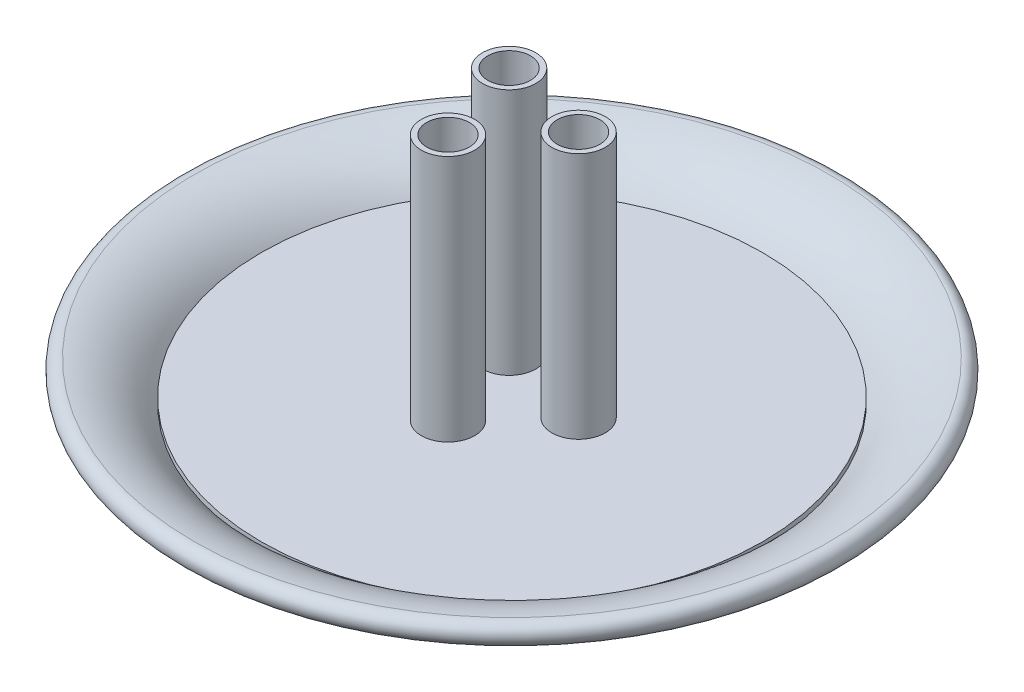
ISO-10303-21;
HEADER;
FILE_DESCRIPTION(('STEP AP214'),'2;1');
FILE_NAME('part.step','',(''),(''),'','','');
FILE_SCHEMA(('AUTOMOTIVE_DESIGN { 1 0 10303 214 1 1 1 1 }'));
ENDSEC;
DATA;
#1=APPLICATION_CONTEXT('core data for automotive mechanical design processes');
#2=APPLICATION_PROTOCOL_DEFINITION('international standard','automotive_design',2000,#1);
#3=PRODUCT_CONTEXT('',#1,'mechanical');
#4=PRODUCT('Part','Part','',(#3));
#5=PRODUCT_RELATED_PRODUCT_CATEGORY('part','',(#4));
#6=PRODUCT_DEFINITION_FORMATION('','',#4);
#7=PRODUCT_DEFINITION_CONTEXT('part definition',#1,'design');
#8=PRODUCT_DEFINITION('design','',#6,#7);
#9=PRODUCT_DEFINITION_SHAPE('','',#8);
#10=(LENGTH_UNIT() NAMED_UNIT(*) SI_UNIT(.MILLI.,.METRE.));
#11=(NAMED_UNIT(*) PLANE_ANGLE_UNIT() SI_UNIT($,.RADIAN.));
#12=(NAMED_UNIT(*) SI_UNIT($,.STERADIAN.) SOLID_ANGLE_UNIT());
#13=UNCERTAINTY_MEASURE_WITH_UNIT(LENGTH_MEASURE(1.E-05),#10,'distance_accuracy_value','');
#14=(GEOMETRIC_REPRESENTATION_CONTEXT(3) GLOBAL_UNCERTAINTY_ASSIGNED_CONTEXT((#13)) GLOBAL_UNIT_ASSIGNED_CONTEXT((#10,
#11,#12)) REPRESENTATION_CONTEXT('',''));
#15=CARTESIAN_POINT('',(0.,0.,0.));
#16=DIRECTION('',(0.,0.,1.));
#17=DIRECTION('',(1.,0.,0.));
#18=AXIS2_PLACEMENT_3D('',#15,#16,#17);
#19=CARTESIAN_POINT('',(13.1192660550459,6.17806077003984,0.));
#20=DIRECTION('',(0.,1.,0.));
#21=DIRECTION('',(0.,0.,1.));
#22=AXIS2_PLACEMENT_3D('',#19,#20,#21);
#23=TOROIDAL_SURFACE('',#22,29.8959735549191,1.);
#24=CARTESIAN_POINT('',(13.1192660550459,5.18348623853211,0.));
#25=DIRECTION('',(0.,1.,0.));
#26=DIRECTION('',(0.,0.,1.));
#27=AXIS2_PLACEMENT_3D('',#24,#25,#26);
#28=CIRCLE('',#27,30.);
#29=CARTESIAN_POINT('',(13.1192660550459,5.18348623853211,30.));
#30=VERTEX_POINT('',#29);
#31=EDGE_CURVE('E134',#30,#30,#28,.T.);
#32=ORIENTED_EDGE('',*,*,#31,.T.);
#33=EDGE_LOOP('',(#32));
#34=FACE_BOUND('',#33,.T.);
#35=CARTESIAN_POINT('',(13.1192660550459,7.17263530154758,0.));
#36=DIRECTION('',(0.,1.,0.));
#37=DIRECTION('',(0.,0.,1.));
#38=AXIS2_PLACEMENT_3D('',#35,#36,#37);
#39=CIRCLE('',#38,29.7919471098382);
#40=CARTESIAN_POINT('',(13.1192660550459,7.17263530154758,29.7919471098382));
#41=VERTEX_POINT('',#40);
#42=EDGE_CURVE('E151',#41,#41,#39,.T.);
#43=ORIENTED_EDGE('',*,*,#42,.F.);
#44=EDGE_LOOP('',(#43));
#45=FACE_BOUND('',#44,.T.);
#46=ADVANCED_FACE('F74',(#34,#45),#23,.T.);
#47=CARTESIAN_POINT('',(13.1192660550459,-1.67957037368538,0.));
#48=DIRECTION('',(0.,1.,0.));
#49=DIRECTION('',(0.,0.,1.));
#50=AXIS2_PLACEMENT_3D('',#47,#48,#49);
#51=TOROIDAL_SURFACE('',#50,30.7178339673305,8.90049503058699);
#52=ORIENTED_EDGE('',*,*,#42,.T.);
#53=EDGE_LOOP('',(#52));
#54=FACE_BOUND('',#53,.T.);
#55=CARTESIAN_POINT('',(13.1192660550459,3.51639603535897,0.));
#56=DIRECTION('',(0.,1.,0.));
#57=DIRECTION('',(0.,0.,1.));
#58=AXIS2_PLACEMENT_3D('',#55,#56,#57);
#59=CIRCLE('',#58,23.4914417232306);
#60=CARTESIAN_POINT('',(13.1192660550459,3.51639603535897,23.4914417232306));
#61=VERTEX_POINT('',#60);
#62=EDGE_CURVE('E148',#61,#61,#59,.T.);
#63=ORIENTED_EDGE('',*,*,#62,.F.);
#64=EDGE_LOOP('',(#63));
#65=FACE_BOUND('',#64,.T.);
#66=ADVANCED_FACE('F292',(#54,#65),#51,.T.);
#67=CARTESIAN_POINT('',(3.11926605504587,-4.81651376146789,0.));
#68=DIRECTION('',(0.,-1.,0.));
#69=DIRECTION('',(0.,0.,-1.));
#70=AXIS2_PLACEMENT_3D('',#67,#68,#69);
#71=PLANE('',#70);
#72=CARTESIAN_POINT('',(13.1192660550459,-4.81651376146789,0.));
#73=DIRECTION('',(0.,1.,0.));
#74=DIRECTION('',(0.,0.,1.));
#75=AXIS2_PLACEMENT_3D('',#72,#73,#74);
#76=CIRCLE('',#75,9.99999999999998);
#77=CARTESIAN_POINT('',(13.1192660550459,-4.81651376146789,9.99999999999998));
#78=VERTEX_POINT('',#77);
#79=EDGE_CURVE('E142',#78,#78,#76,.T.);
#80=ORIENTED_EDGE('',*,*,#79,.F.);
#81=EDGE_LOOP('',(#80));
#82=FACE_BOUND('',#81,.T.);
#83=ADVANCED_FACE('F297',(#82),#71,.T.);
#84=CARTESIAN_POINT('',(13.1192660550459,22.866819708958,0.));
#85=DIRECTION('',(0.,1.,0.));
#86=DIRECTION('',(0.,0.,1.));
#87=AXIS2_PLACEMENT_3D('',#84,#85,#86);
#88=DEGENERATE_TOROIDAL_SURFACE('',#87,6.21444438046789,27.9409624634402,.T.);
#89=ORIENTED_EDGE('',*,*,#79,.T.);
#90=EDGE_LOOP('',(#89));
#91=FACE_BOUND('',#90,.T.);
#92=CARTESIAN_POINT('',(13.1192660550459,2.18348623853211,0.));
#93=DIRECTION('',(0.,1.,0.));
#94=DIRECTION('',(0.,0.,1.));
#95=AXIS2_PLACEMENT_3D('',#92,#93,#94);
#96=CIRCLE('',#95,25.);
#97=CARTESIAN_POINT('',(13.1192660550459,2.18348623853211,25.));
#98=VERTEX_POINT('',#97);
#99=EDGE_CURVE('E139',#98,#98,#96,.T.);
#100=ORIENTED_EDGE('',*,*,#99,.F.);
#101=EDGE_LOOP('',(#100));
#102=FACE_BOUND('',#101,.T.);
#103=ADVANCED_FACE('F496',(#91,#102),#88,.T.);
#104=CARTESIAN_POINT('',(13.1192660550459,-1.67957037368538,0.));
#105=DIRECTION('',(0.,1.,0.));
#106=DIRECTION('',(0.,0.,1.));
#107=AXIS2_PLACEMENT_3D('',#104,#105,#106);
#108=TOROIDAL_SURFACE('',#107,30.7178339673305,6.90049503058699);
#109=ORIENTED_EDGE('',*,*,#99,.T.);
#110=EDGE_LOOP('',(#109));
#111=FACE_BOUND('',#110,.T.);
#112=ORIENTED_EDGE('',*,*,#31,.F.);
#113=EDGE_LOOP('',(#112));
#114=FACE_BOUND('',#113,.T.);
#115=ADVANCED_FACE('F311',(#111,#114),#108,.F.);
#116=CARTESIAN_POINT('',(13.1192660550459,4.,0.));
#117=DIRECTION('',(0.,1.,0.));
#118=DIRECTION('',(0.,0.,1.));
#119=AXIS2_PLACEMENT_3D('',#116,#117,#118);
#120=PLANE('',#119);
#121=CARTESIAN_POINT('',(9.45576268503444,4.,-3.40275521569139));
#122=DIRECTION('',(0.,1.,0.));
#123=DIRECTION('',(0.,0.,1.));
#124=AXIS2_PLACEMENT_3D('',#121,#122,#123);
#125=CIRCLE('',#124,2.5);
#126=CARTESIAN_POINT('',(9.45576268503444,4.,-0.902755215691387));
#127=VERTEX_POINT('',#126);
#128=EDGE_CURVE('E105',#127,#127,#125,.T.);
#129=ORIENTED_EDGE('',*,*,#128,.F.);
#130=EDGE_LOOP('',(#129));
#131=FACE_BOUND('',#130,.T.);
#132=CARTESIAN_POINT('',(17.8978901997003,4.,-1.47130937743408));
#133=DIRECTION('',(0.,1.,0.));
#134=DIRECTION('',(0.,0.,1.));
#135=AXIS2_PLACEMENT_3D('',#132,#133,#134);
#136=CIRCLE('',#135,2.5);
#137=CARTESIAN_POINT('',(17.8978901997003,4.,1.02869062256592));
#138=VERTEX_POINT('',#137);
#139=EDGE_CURVE('E99',#138,#138,#136,.T.);
#140=ORIENTED_EDGE('',*,*,#139,.F.);
#141=EDGE_LOOP('',(#140));
#142=FACE_BOUND('',#141,.T.);
#143=CARTESIAN_POINT('',(12.0041452804028,4.,4.87406459312548));
#144=DIRECTION('',(0.,1.,0.));
#145=DIRECTION('',(0.,0.,1.));
#146=AXIS2_PLACEMENT_3D('',#143,#144,#145);
#147=CIRCLE('',#146,2.5);
#148=CARTESIAN_POINT('',(12.0041452804028,4.,7.37406459312548));
#149=VERTEX_POINT('',#148);
#150=EDGE_CURVE('E96',#149,#149,#147,.T.);
#151=ORIENTED_EDGE('',*,*,#150,.F.);
#152=EDGE_LOOP('',(#151));
#153=FACE_BOUND('',#152,.T.);
#154=CARTESIAN_POINT('',(13.1192660550459,4.,0.));
#155=DIRECTION('',(0.,1.,0.));
#156=DIRECTION('',(0.,0.,1.));
#157=AXIS2_PLACEMENT_3D('',#154,#155,#156);
#158=CIRCLE('',#157,23.4914417232306);
#159=CARTESIAN_POINT('',(13.1192660550459,4.,23.4914417232306));
#160=VERTEX_POINT('',#159);
#161=EDGE_CURVE('E165',#160,#160,#158,.T.);
#162=ORIENTED_EDGE('',*,*,#161,.T.);
#163=EDGE_LOOP('',(#162));
#164=FACE_BOUND('',#163,.T.);
#165=ADVANCED_FACE('F307',(#131,#142,#153,#164),#120,.T.);
#166=CARTESIAN_POINT('',(13.1192660550459,4.,0.));
#167=DIRECTION('',(0.,-1.,0.));
#168=DIRECTION('',(0.,0.,-1.));
#169=AXIS2_PLACEMENT_3D('',#166,#167,#168);
#170=CYLINDRICAL_SURFACE('',#169,23.4914417232306);
#171=ORIENTED_EDGE('',*,*,#62,.T.);
#172=EDGE_LOOP('',(#171));
#173=FACE_BOUND('',#172,.T.);
#174=ORIENTED_EDGE('',*,*,#161,.F.);
#175=EDGE_LOOP('',(#174));
#176=FACE_BOUND('',#175,.T.);
#177=ADVANCED_FACE('F208',(#173,#176),#170,.T.);
#178=CARTESIAN_POINT('',(17.8978901997003,27.1834862385321,-1.47130937743408));
#179=DIRECTION('',(0.,-1.,0.));
#180=DIRECTION('',(0.,0.,-1.));
#181=AXIS2_PLACEMENT_3D('',#178,#179,#180);
#182=CYLINDRICAL_SURFACE('',#181,2.5);
#183=ORIENTED_EDGE('',*,*,#139,.T.);
#184=EDGE_LOOP('',(#183));
#185=FACE_BOUND('',#184,.T.);
#186=CARTESIAN_POINT('',(17.8978901997003,27.1834862385321,-1.47130937743408));
#187=DIRECTION('',(0.,1.,0.));
#188=DIRECTION('',(0.,0.,1.));
#189=AXIS2_PLACEMENT_3D('',#186,#187,#188);
#190=CIRCLE('',#189,2.5);
#191=CARTESIAN_POINT('',(17.8978901997003,27.1834862385321,1.02869062256592));
#192=VERTEX_POINT('',#191);
#193=EDGE_CURVE('E122',#192,#192,#190,.T.);
#194=ORIENTED_EDGE('',*,*,#193,.F.);
#195=EDGE_LOOP('',(#194));
#196=FACE_BOUND('',#195,.T.);
#197=ADVANCED_FACE('F188',(#185,#196),#182,.T.);
#198=CARTESIAN_POINT('',(17.8978901997003,27.1834862385321,-1.47130937743408));
#199=DIRECTION('',(0.,1.,0.));
#200=DIRECTION('',(0.,0.,1.));
#201=AXIS2_PLACEMENT_3D('',#198,#199,#200);
#202=PLANE('',#201);
#203=ORIENTED_EDGE('',*,*,#193,.T.);
#204=EDGE_LOOP('',(#203));
#205=FACE_BOUND('',#204,.T.);
#206=CARTESIAN_POINT('',(17.8978901997003,27.1834862385321,-1.47130937743408));
#207=DIRECTION('',(0.,1.,0.));
#208=DIRECTION('',(0.,0.,1.));
#209=AXIS2_PLACEMENT_3D('',#206,#207,#208);
#210=CIRCLE('',#209,2.);
#211=CARTESIAN_POINT('',(17.8978901997003,27.1834862385321,0.528690622565919));
#212=VERTEX_POINT('',#211);
#213=EDGE_CURVE('E116',#212,#212,#210,.T.);
#214=ORIENTED_EDGE('',*,*,#213,.F.);
#215=EDGE_LOOP('',(#214));
#216=FACE_BOUND('',#215,.T.);
#217=ADVANCED_FACE('F207',(#205,#216),#202,.T.);
#218=CARTESIAN_POINT('',(17.8978901997003,27.1834862385321,-1.47130937743408));
#219=DIRECTION('',(0.,-1.,0.));
#220=DIRECTION('',(0.,0.,-1.));
#221=AXIS2_PLACEMENT_3D('',#218,#219,#220);
#222=CYLINDRICAL_SURFACE('',#221,2.);
#223=CARTESIAN_POINT('',(17.8978901997003,4.,-1.47130937743408));
#224=DIRECTION('',(0.,1.,0.));
#225=DIRECTION('',(0.,0.,1.));
#226=AXIS2_PLACEMENT_3D('',#223,#224,#225);
#227=CIRCLE('',#226,2.);
#228=CARTESIAN_POINT('',(17.8978901997003,4.,0.528690622565919));
#229=VERTEX_POINT('',#228);
#230=EDGE_CURVE('E100',#229,#229,#227,.T.);
#231=ORIENTED_EDGE('',*,*,#230,.F.);
#232=EDGE_LOOP('',(#231));
#233=FACE_BOUND('',#232,.T.);
#234=ORIENTED_EDGE('',*,*,#213,.T.);
#235=EDGE_LOOP('',(#234));
#236=FACE_BOUND('',#235,.T.);
#237=ADVANCED_FACE('F260',(#233,#236),#222,.F.);
#238=CARTESIAN_POINT('',(9.45576268503444,27.1834862385321,-3.40275521569139));
#239=DIRECTION('',(0.,-1.,0.));
#240=DIRECTION('',(0.,0.,-1.));
#241=AXIS2_PLACEMENT_3D('',#238,#239,#240);
#242=CYLINDRICAL_SURFACE('',#241,2.5);
#243=ORIENTED_EDGE('',*,*,#128,.T.);
#244=EDGE_LOOP('',(#243));
#245=FACE_BOUND('',#244,.T.);
#246=CARTESIAN_POINT('',(9.45576268503444,27.1834862385321,-3.40275521569139));
#247=DIRECTION('',(0.,1.,0.));
#248=DIRECTION('',(0.,0.,1.));
#249=AXIS2_PLACEMENT_3D('',#246,#247,#248);
#250=CIRCLE('',#249,2.5);
#251=CARTESIAN_POINT('',(9.45576268503444,27.1834862385321,-0.902755215691387));
#252=VERTEX_POINT('',#251);
#253=EDGE_CURVE('E131',#252,#252,#250,.T.);
#254=ORIENTED_EDGE('',*,*,#253,.F.);
#255=EDGE_LOOP('',(#254));
#256=FACE_BOUND('',#255,.T.);
#257=ADVANCED_FACE('F202',(#245,#256),#242,.T.);
#258=CARTESIAN_POINT('',(9.45576268503444,27.1834862385321,-3.40275521569139));
#259=DIRECTION('',(0.,1.,0.));
#260=DIRECTION('',(0.,0.,1.));
#261=AXIS2_PLACEMENT_3D('',#258,#259,#260);
#262=PLANE('',#261);
#263=ORIENTED_EDGE('',*,*,#253,.T.);
#264=EDGE_LOOP('',(#263));
#265=FACE_BOUND('',#264,.T.);
#266=CARTESIAN_POINT('',(9.45576268503444,27.1834862385321,-3.40275521569139));
#267=DIRECTION('',(0.,1.,0.));
#268=DIRECTION('',(0.,0.,1.));
#269=AXIS2_PLACEMENT_3D('',#266,#267,#268);
#270=CIRCLE('',#269,2.);
#271=CARTESIAN_POINT('',(9.45576268503444,27.1834862385321,-1.40275521569139));
#272=VERTEX_POINT('',#271);
#273=EDGE_CURVE('E125',#272,#272,#270,.T.);
#274=ORIENTED_EDGE('',*,*,#273,.F.);
#275=EDGE_LOOP('',(#274));
#276=FACE_BOUND('',#275,.T.);
#277=ADVANCED_FACE('F279',(#265,#276),#262,.T.);
#278=CARTESIAN_POINT('',(9.45576268503444,27.1834862385321,-3.40275521569139));
#279=DIRECTION('',(0.,-1.,0.));
#280=DIRECTION('',(0.,0.,-1.));
#281=AXIS2_PLACEMENT_3D('',#278,#279,#280);
#282=CYLINDRICAL_SURFACE('',#281,2.);
#283=CARTESIAN_POINT('',(9.45576268503444,4.,-3.40275521569139));
#284=DIRECTION('',(0.,1.,0.));
#285=DIRECTION('',(0.,0.,1.));
#286=AXIS2_PLACEMENT_3D('',#283,#284,#285);
#287=CIRCLE('',#286,2.);
#288=CARTESIAN_POINT('',(9.45576268503444,4.,-1.40275521569139));
#289=VERTEX_POINT('',#288);
#290=EDGE_CURVE('E82',#289,#289,#287,.T.);
#291=ORIENTED_EDGE('',*,*,#290,.F.);
#292=EDGE_LOOP('',(#291));
#293=FACE_BOUND('',#292,.T.);
#294=ORIENTED_EDGE('',*,*,#273,.T.);
#295=EDGE_LOOP('',(#294));
#296=FACE_BOUND('',#295,.T.);
#297=ADVANCED_FACE('F269',(#293,#296),#282,.F.);
#298=CARTESIAN_POINT('',(12.0041452804028,27.1834862385321,4.87406459312548));
#299=DIRECTION('',(0.,-1.,0.));
#300=DIRECTION('',(0.,0.,-1.));
#301=AXIS2_PLACEMENT_3D('',#298,#299,#300);
#302=CYLINDRICAL_SURFACE('',#301,2.5);
#303=ORIENTED_EDGE('',*,*,#150,.T.);
#304=EDGE_LOOP('',(#303));
#305=FACE_BOUND('',#304,.T.);
#306=CARTESIAN_POINT('',(12.0041452804028,27.1834862385321,4.87406459312548));
#307=DIRECTION('',(0.,1.,0.));
#308=DIRECTION('',(0.,0.,1.));
#309=AXIS2_PLACEMENT_3D('',#306,#307,#308);
#310=CIRCLE('',#309,2.5);
#311=CARTESIAN_POINT('',(12.0041452804028,27.1834862385321,7.37406459312548));
#312=VERTEX_POINT('',#311);
#313=EDGE_CURVE('E113',#312,#312,#310,.T.);
#314=ORIENTED_EDGE('',*,*,#313,.F.);
#315=EDGE_LOOP('',(#314));
#316=FACE_BOUND('',#315,.T.);
#317=ADVANCED_FACE('F278',(#305,#316),#302,.T.);
#318=CARTESIAN_POINT('',(12.0041452804028,27.1834862385321,4.87406459312548));
#319=DIRECTION('',(0.,1.,0.));
#320=DIRECTION('',(0.,0.,1.));
#321=AXIS2_PLACEMENT_3D('',#318,#319,#320);
#322=PLANE('',#321);
#323=ORIENTED_EDGE('',*,*,#313,.T.);
#324=EDGE_LOOP('',(#323));
#325=FACE_BOUND('',#324,.T.);
#326=CARTESIAN_POINT('',(12.0041452804028,27.1834862385321,4.87406459312548));
#327=DIRECTION('',(0.,1.,0.));
#328=DIRECTION('',(0.,0.,1.));
#329=AXIS2_PLACEMENT_3D('',#326,#327,#328);
#330=CIRCLE('',#329,2.);
#331=CARTESIAN_POINT('',(12.0041452804028,27.1834862385321,6.87406459312548));
#332=VERTEX_POINT('',#331);
#333=EDGE_CURVE('E109',#332,#332,#330,.T.);
#334=ORIENTED_EDGE('',*,*,#333,.F.);
#335=EDGE_LOOP('',(#334));
#336=FACE_BOUND('',#335,.T.);
#337=ADVANCED_FACE('F285',(#325,#336),#322,.T.);
#338=CARTESIAN_POINT('',(12.0041452804028,27.1834862385321,4.87406459312548));
#339=DIRECTION('',(0.,-1.,0.));
#340=DIRECTION('',(0.,0.,-1.));
#341=AXIS2_PLACEMENT_3D('',#338,#339,#340);
#342=CYLINDRICAL_SURFACE('',#341,2.);
#343=CARTESIAN_POINT('',(12.0041452804028,4.,4.87406459312548));
#344=DIRECTION('',(0.,1.,0.));
#345=DIRECTION('',(0.,0.,1.));
#346=AXIS2_PLACEMENT_3D('',#343,#344,#345);
#347=CIRCLE('',#346,2.);
#348=CARTESIAN_POINT('',(12.0041452804028,4.,6.87406459312548));
#349=VERTEX_POINT('',#348);
#350=EDGE_CURVE('E77',#349,#349,#347,.T.);
#351=ORIENTED_EDGE('',*,*,#350,.F.);
#352=EDGE_LOOP('',(#351));
#353=FACE_BOUND('',#352,.T.);
#354=ORIENTED_EDGE('',*,*,#333,.T.);
#355=EDGE_LOOP('',(#354));
#356=FACE_BOUND('',#355,.T.);
#357=ADVANCED_FACE('F240',(#353,#356),#342,.F.);
#358=ORIENTED_EDGE('',*,*,#230,.T.);
#359=EDGE_LOOP('',(#358));
#360=FACE_BOUND('',#359,.T.);
#361=ADVANCED_FACE('F317',(#360),#120,.T.);
#362=ORIENTED_EDGE('',*,*,#290,.T.);
#363=EDGE_LOOP('',(#362));
#364=FACE_BOUND('',#363,.T.);
#365=ADVANCED_FACE('F313',(#364),#120,.T.);
#366=ORIENTED_EDGE('',*,*,#350,.T.);
#367=EDGE_LOOP('',(#366));
#368=FACE_BOUND('',#367,.T.);
#369=ADVANCED_FACE('F314',(#368),#120,.T.);
#370=CLOSED_SHELL('',(#46,#66,#83,#103,#115,#165,#177,#197,#217,#237,#257,#277,#297,#317,#337,
#357,#361,#365,#369));
#371=CARTESIAN_POINT('',(3.25791677089404,-2.81651376146789,0.));
#372=DIRECTION('',(0.,1.,0.));
#373=DIRECTION('',(0.,0.,1.));
#374=AXIS2_PLACEMENT_3D('',#371,#372,#373);
#375=PLANE('',#374);
#376=CARTESIAN_POINT('',(9.45576268503444,-2.81651376146789,-3.40275521569139));
#377=DIRECTION('',(0.,1.,0.));
#378=DIRECTION('',(0.,0.,1.));
#379=AXIS2_PLACEMENT_3D('',#376,#377,#378);
#380=CIRCLE('',#379,2.);
#381=CARTESIAN_POINT('',(9.45576268503444,-2.81651376146789,-1.40275521569139));
#382=VERTEX_POINT('',#381);
#383=EDGE_CURVE('E154',#382,#382,#380,.F.);
#384=ORIENTED_EDGE('',*,*,#383,.F.);
#385=EDGE_LOOP('',(#384));
#386=FACE_BOUND('',#385,.T.);
#387=ADVANCED_FACE('F198',(#386),#375,.T.);
#388=ORIENTED_EDGE('',*,*,#383,.T.);
#389=EDGE_LOOP('',(#388));
#390=FACE_BOUND('',#389,.T.);
#391=CARTESIAN_POINT('',(9.45576268503444,2.,-3.40275521569139));
#392=DIRECTION('',(0.,1.,0.));
#393=DIRECTION('',(0.,0.,1.));
#394=AXIS2_PLACEMENT_3D('',#391,#392,#393);
#395=CIRCLE('',#394,2.);
#396=CARTESIAN_POINT('',(9.45576268503444,2.,-1.40275521569139));
#397=VERTEX_POINT('',#396);
#398=EDGE_CURVE('E91',#397,#397,#395,.T.);
#399=ORIENTED_EDGE('',*,*,#398,.T.);
#400=EDGE_LOOP('',(#399));
#401=FACE_BOUND('',#400,.T.);
#402=ADVANCED_FACE('F227',(#390,#401),#282,.F.);
#403=CARTESIAN_POINT('',(13.1192660550459,2.,0.));
#404=DIRECTION('',(0.,1.,0.));
#405=DIRECTION('',(0.,0.,1.));
#406=AXIS2_PLACEMENT_3D('',#403,#404,#405);
#407=PLANE('',#406);
#408=ORIENTED_EDGE('',*,*,#398,.F.);
#409=EDGE_LOOP('',(#408));
#410=FACE_BOUND('',#409,.T.);
#411=ADVANCED_FACE('F216',(#410),#407,.F.);
#412=CLOSED_SHELL('',(#387,#402,#411));
#413=CARTESIAN_POINT('',(17.8978901997003,-2.81651376146789,-1.47130937743408));
#414=DIRECTION('',(0.,1.,0.));
#415=DIRECTION('',(0.,0.,1.));
#416=AXIS2_PLACEMENT_3D('',#413,#414,#415);
#417=CIRCLE('',#416,2.);
#418=CARTESIAN_POINT('',(17.8978901997003,-2.81651376146789,0.528690622565919));
#419=VERTEX_POINT('',#418);
#420=EDGE_CURVE('E157',#419,#419,#417,.F.);
#421=ORIENTED_EDGE('',*,*,#420,.F.);
#422=EDGE_LOOP('',(#421));
#423=FACE_BOUND('',#422,.T.);
#424=ADVANCED_FACE('F247',(#423),#375,.T.);
#425=ORIENTED_EDGE('',*,*,#420,.T.);
#426=EDGE_LOOP('',(#425));
#427=FACE_BOUND('',#426,.T.);
#428=CARTESIAN_POINT('',(17.8978901997003,2.,-1.47130937743408));
#429=DIRECTION('',(0.,1.,0.));
#430=DIRECTION('',(0.,0.,1.));
#431=AXIS2_PLACEMENT_3D('',#428,#429,#430);
#432=CIRCLE('',#431,2.);
#433=CARTESIAN_POINT('',(17.8978901997003,2.,0.528690622565919));
#434=VERTEX_POINT('',#433);
#435=EDGE_CURVE('E164',#434,#434,#432,.T.);
#436=ORIENTED_EDGE('',*,*,#435,.T.);
#437=EDGE_LOOP('',(#436));
#438=FACE_BOUND('',#437,.T.);
#439=ADVANCED_FACE('F241',(#427,#438),#222,.F.);
#440=ORIENTED_EDGE('',*,*,#435,.F.);
#441=EDGE_LOOP('',(#440));
#442=FACE_BOUND('',#441,.T.);
#443=ADVANCED_FACE('F229',(#442),#407,.F.);
#444=CLOSED_SHELL('',(#424,#439,#443));
#445=CARTESIAN_POINT('',(12.0041452804028,2.,4.87406459312548));
#446=DIRECTION('',(0.,1.,0.));
#447=DIRECTION('',(0.,0.,1.));
#448=AXIS2_PLACEMENT_3D('',#445,#446,#447);
#449=CIRCLE('',#448,2.5);
#450=CARTESIAN_POINT('',(12.0041452804028,2.,7.37406459312548));
#451=VERTEX_POINT('',#450);
#452=EDGE_CURVE('E103',#451,#451,#449,.T.);
#453=ORIENTED_EDGE('',*,*,#452,.T.);
#454=EDGE_LOOP('',(#453));
#455=FACE_BOUND('',#454,.T.);
#456=CARTESIAN_POINT('',(17.8978901997003,2.,-1.47130937743408));
#457=DIRECTION('',(0.,1.,0.));
#458=DIRECTION('',(0.,0.,1.));
#459=AXIS2_PLACEMENT_3D('',#456,#457,#458);
#460=CIRCLE('',#459,2.5);
#461=CARTESIAN_POINT('',(17.8978901997003,2.,1.02869062256592));
#462=VERTEX_POINT('',#461);
#463=EDGE_CURVE('E87',#462,#462,#460,.T.);
#464=ORIENTED_EDGE('',*,*,#463,.T.);
#465=EDGE_LOOP('',(#464));
#466=FACE_BOUND('',#465,.T.);
#467=CARTESIAN_POINT('',(9.45576268503444,2.,-3.40275521569139));
#468=DIRECTION('',(0.,1.,0.));
#469=DIRECTION('',(0.,0.,1.));
#470=AXIS2_PLACEMENT_3D('',#467,#468,#469);
#471=CIRCLE('',#470,2.5);
#472=CARTESIAN_POINT('',(9.45576268503444,2.,-0.902755215691387));
#473=VERTEX_POINT('',#472);
#474=EDGE_CURVE('E11',#473,#473,#471,.T.);
#475=ORIENTED_EDGE('',*,*,#474,.T.);
#476=EDGE_LOOP('',(#475));
#477=FACE_BOUND('',#476,.T.);
#478=CARTESIAN_POINT('',(13.1192660550459,2.,0.));
#479=DIRECTION('',(0.,1.,0.));
#480=DIRECTION('',(0.,0.,1.));
#481=AXIS2_PLACEMENT_3D('',#478,#479,#480);
#482=CIRCLE('',#481,21.6257833477171);
#483=CARTESIAN_POINT('',(13.1192660550459,2.,21.6257833477171));
#484=VERTEX_POINT('',#483);
#485=EDGE_CURVE('E93',#484,#484,#482,.T.);
#486=ORIENTED_EDGE('',*,*,#485,.F.);
#487=EDGE_LOOP('',(#486));
#488=FACE_BOUND('',#487,.T.);
#489=ADVANCED_FACE('F179',(#455,#466,#477,#488),#407,.F.);
#490=CARTESIAN_POINT('',(13.1192660550459,22.866819708958,0.));
#491=DIRECTION('',(0.,1.,0.));
#492=DIRECTION('',(0.,0.,1.));
#493=AXIS2_PLACEMENT_3D('',#490,#491,#492);
#494=DEGENERATE_TOROIDAL_SURFACE('',#493,6.21444438046789,25.9409624634402,.T.);
#495=CARTESIAN_POINT('',(13.1192660550459,-2.81651376146789,0.));
#496=DIRECTION('',(0.,1.,0.));
#497=DIRECTION('',(0.,0.,1.));
#498=AXIS2_PLACEMENT_3D('',#495,#496,#497);
#499=CIRCLE('',#498,9.86134928415182);
#500=CARTESIAN_POINT('',(13.1192660550459,-2.81651376146789,9.86134928415182));
#501=VERTEX_POINT('',#500);
#502=EDGE_CURVE('E145',#501,#501,#499,.T.);
#503=ORIENTED_EDGE('',*,*,#502,.F.);
#504=EDGE_LOOP('',(#503));
#505=FACE_BOUND('',#504,.T.);
#506=ORIENTED_EDGE('',*,*,#485,.T.);
#507=EDGE_LOOP('',(#506));
#508=FACE_BOUND('',#507,.T.);
#509=ADVANCED_FACE('F199',(#505,#508),#494,.F.);
#510=CARTESIAN_POINT('',(9.45576268503444,-2.81651376146789,-3.40275521569139));
#511=DIRECTION('',(0.,1.,0.));
#512=DIRECTION('',(0.,0.,1.));
#513=AXIS2_PLACEMENT_3D('',#510,#511,#512);
#514=CIRCLE('',#513,2.5);
#515=CARTESIAN_POINT('',(9.45576268503444,-2.81651376146789,-0.902755215691387));
#516=VERTEX_POINT('',#515);
#517=EDGE_CURVE('E130',#516,#516,#514,.T.);
#518=ORIENTED_EDGE('',*,*,#517,.T.);
#519=EDGE_LOOP('',(#518));
#520=FACE_BOUND('',#519,.T.);
#521=ORIENTED_EDGE('',*,*,#474,.F.);
#522=EDGE_LOOP('',(#521));
#523=FACE_BOUND('',#522,.T.);
#524=ADVANCED_FACE('F184',(#520,#523),#242,.T.);
#525=CARTESIAN_POINT('',(17.8978901997003,-2.81651376146789,-1.47130937743408));
#526=DIRECTION('',(0.,1.,0.));
#527=DIRECTION('',(0.,0.,1.));
#528=AXIS2_PLACEMENT_3D('',#525,#526,#527);
#529=CIRCLE('',#528,2.5);
#530=CARTESIAN_POINT('',(17.8978901997003,-2.81651376146789,1.02869062256592));
#531=VERTEX_POINT('',#530);
#532=EDGE_CURVE('E121',#531,#531,#529,.T.);
#533=ORIENTED_EDGE('',*,*,#532,.T.);
#534=EDGE_LOOP('',(#533));
#535=FACE_BOUND('',#534,.T.);
#536=ORIENTED_EDGE('',*,*,#463,.F.);
#537=EDGE_LOOP('',(#536));
#538=FACE_BOUND('',#537,.T.);
#539=ADVANCED_FACE('F181',(#535,#538),#182,.T.);
#540=CARTESIAN_POINT('',(12.0041452804028,-2.81651376146789,4.87406459312548));
#541=DIRECTION('',(0.,1.,0.));
#542=DIRECTION('',(0.,0.,1.));
#543=AXIS2_PLACEMENT_3D('',#540,#541,#542);
#544=CIRCLE('',#543,2.5);
#545=CARTESIAN_POINT('',(12.0041452804028,-2.81651376146789,7.37406459312548));
#546=VERTEX_POINT('',#545);
#547=EDGE_CURVE('E112',#546,#546,#544,.T.);
#548=ORIENTED_EDGE('',*,*,#547,.F.);
#549=EDGE_LOOP('',(#548));
#550=FACE_BOUND('',#549,.T.);
#551=ORIENTED_EDGE('',*,*,#532,.F.);
#552=EDGE_LOOP('',(#551));
#553=FACE_BOUND('',#552,.T.);
#554=ORIENTED_EDGE('',*,*,#517,.F.);
#555=EDGE_LOOP('',(#554));
#556=FACE_BOUND('',#555,.T.);
#557=ORIENTED_EDGE('',*,*,#502,.T.);
#558=EDGE_LOOP('',(#557));
#559=FACE_BOUND('',#558,.T.);
#560=ADVANCED_FACE('F183',(#550,#553,#556,#559),#375,.T.);
#561=ORIENTED_EDGE('',*,*,#547,.T.);
#562=EDGE_LOOP('',(#561));
#563=FACE_BOUND('',#562,.T.);
#564=ORIENTED_EDGE('',*,*,#452,.F.);
#565=EDGE_LOOP('',(#564));
#566=FACE_BOUND('',#565,.T.);
#567=ADVANCED_FACE('F194',(#563,#566),#302,.T.);
#568=CLOSED_SHELL('',(#489,#509,#524,#539,#560,#567));
#569=CARTESIAN_POINT('',(12.0041452804028,-2.81651376146789,4.87406459312548));
#570=DIRECTION('',(0.,1.,0.));
#571=DIRECTION('',(0.,0.,1.));
#572=AXIS2_PLACEMENT_3D('',#569,#570,#571);
#573=CIRCLE('',#572,2.);
#574=CARTESIAN_POINT('',(12.0041452804028,-2.81651376146789,6.87406459312548));
#575=VERTEX_POINT('',#574);
#576=EDGE_CURVE('E160',#575,#575,#573,.F.);
#577=ORIENTED_EDGE('',*,*,#576,.F.);
#578=EDGE_LOOP('',(#577));
#579=FACE_BOUND('',#578,.T.);
#580=ADVANCED_FACE('F197',(#579),#375,.T.);
#581=ORIENTED_EDGE('',*,*,#576,.T.);
#582=EDGE_LOOP('',(#581));
#583=FACE_BOUND('',#582,.T.);
#584=CARTESIAN_POINT('',(12.0041452804028,2.,4.87406459312548));
#585=DIRECTION('',(0.,1.,0.));
#586=DIRECTION('',(0.,0.,1.));
#587=AXIS2_PLACEMENT_3D('',#584,#585,#586);
#588=CIRCLE('',#587,2.);
#589=CARTESIAN_POINT('',(12.0041452804028,2.,6.87406459312548));
#590=VERTEX_POINT('',#589);
#591=EDGE_CURVE('E162',#590,#590,#588,.T.);
#592=ORIENTED_EDGE('',*,*,#591,.T.);
#593=EDGE_LOOP('',(#592));
#594=FACE_BOUND('',#593,.T.);
#595=ADVANCED_FACE('F232',(#583,#594),#342,.F.);
#596=ORIENTED_EDGE('',*,*,#591,.F.);
#597=EDGE_LOOP('',(#596));
#598=FACE_BOUND('',#597,.T.);
#599=ADVANCED_FACE('F217',(#598),#407,.F.);
#600=CLOSED_SHELL('',(#580,#595,#599));
#601=ORIENTED_CLOSED_SHELL('',*,#412,.T.);
#602=ORIENTED_CLOSED_SHELL('',*,#444,.T.);
#603=ORIENTED_CLOSED_SHELL('',*,#568,.T.);
#604=ORIENTED_CLOSED_SHELL('',*,#600,.T.);
#605=BREP_WITH_VOIDS('B2',#370,(#601,#602,#603,#604));
#606=ADVANCED_BREP_SHAPE_REPRESENTATION('',(#18,#605),#14);
#607=SHAPE_DEFINITION_REPRESENTATION(#9,#606);
ENDSEC;
END-ISO-10303-21;
